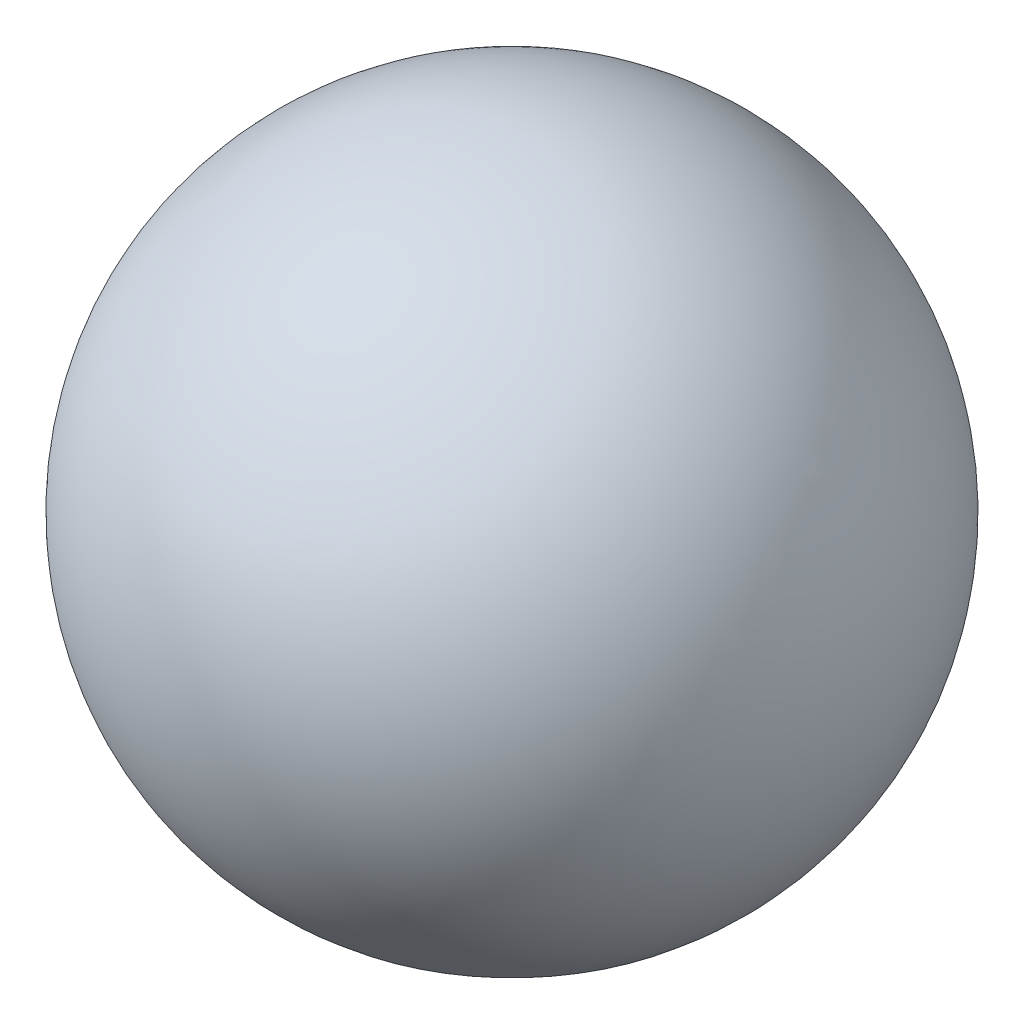
ISO-10303-21;
HEADER;
FILE_DESCRIPTION(('STEP AP214'),'2;1');
FILE_NAME('part.step','',(''),(''),'','','');
FILE_SCHEMA(('AUTOMOTIVE_DESIGN { 1 0 10303 214 1 1 1 1 }'));
ENDSEC;
DATA;
#1=APPLICATION_CONTEXT('core data for automotive mechanical design processes');
#2=APPLICATION_PROTOCOL_DEFINITION('international standard','automotive_design',2000,#1);
#3=PRODUCT_CONTEXT('',#1,'mechanical');
#4=PRODUCT('Part','Part','',(#3));
#5=PRODUCT_RELATED_PRODUCT_CATEGORY('part','',(#4));
#6=PRODUCT_DEFINITION_FORMATION('','',#4);
#7=PRODUCT_DEFINITION_CONTEXT('part definition',#1,'design');
#8=PRODUCT_DEFINITION('design','',#6,#7);
#9=PRODUCT_DEFINITION_SHAPE('','',#8);
#10=(LENGTH_UNIT() NAMED_UNIT(*) SI_UNIT(.MILLI.,.METRE.));
#11=(NAMED_UNIT(*) PLANE_ANGLE_UNIT() SI_UNIT($,.RADIAN.));
#12=(NAMED_UNIT(*) SI_UNIT($,.STERADIAN.) SOLID_ANGLE_UNIT());
#13=UNCERTAINTY_MEASURE_WITH_UNIT(LENGTH_MEASURE(1.E-05),#10,'distance_accuracy_value','');
#14=(GEOMETRIC_REPRESENTATION_CONTEXT(3) GLOBAL_UNCERTAINTY_ASSIGNED_CONTEXT((#13)) GLOBAL_UNIT_ASSIGNED_CONTEXT((#10,
#11,#12)) REPRESENTATION_CONTEXT('',''));
#15=CARTESIAN_POINT('',(0.,0.,0.));
#16=DIRECTION('',(0.,0.,1.));
#17=DIRECTION('',(1.,0.,0.));
#18=AXIS2_PLACEMENT_3D('',#15,#16,#17);
#19=CARTESIAN_POINT('',(0.,1359.,0.));
#20=DIRECTION('',(0.,-1.,0.));
#21=DIRECTION('',(1.,0.,0.));
#22=AXIS2_PLACEMENT_3D('',#19,#20,#21);
#23=SPHERICAL_SURFACE('',#22,1730.);
#24=CARTESIAN_POINT('',(0.,0.,0.));
#25=DIRECTION('',(0.,-1.,0.));
#26=DIRECTION('',(0.,0.,-1.));
#27=AXIS2_PLACEMENT_3D('',#24,#25,#26);
#28=CIRCLE('',#27,1070.52276949162);
#29=CARTESIAN_POINT('',(0.,0.,-1070.52276949162));
#30=VERTEX_POINT('',#29);
#31=EDGE_CURVE('E10',#30,#30,#28,.T.);
#32=ORIENTED_EDGE('',*,*,#31,.F.);
#33=EDGE_LOOP('',(#32));
#34=FACE_BOUND('',#33,.T.);
#35=ADVANCED_FACE('F31',(#34),#23,.T.);
#36=CARTESIAN_POINT('',(1054.28601432439,5.55111512312578E-13,0.));
#37=DIRECTION('',(0.,-1.,0.));
#38=DIRECTION('',(0.,0.,-1.));
#39=AXIS2_PLACEMENT_3D('',#36,#37,#38);
#40=PLANE('',#39);
#41=ORIENTED_EDGE('',*,*,#31,.T.);
#42=EDGE_LOOP('',(#41));
#43=FACE_BOUND('',#42,.T.);
#44=CARTESIAN_POINT('',(0.,1.11022302462516E-12,0.));
#45=DIRECTION('',(0.,-1.,0.));
#46=DIRECTION('',(0.,0.,-1.));
#47=AXIS2_PLACEMENT_3D('',#44,#45,#46);
#48=CIRCLE('',#47,1054.28601432439);
#49=CARTESIAN_POINT('',(0.,1.11022302462516E-12,-1054.28601432439));
#50=VERTEX_POINT('',#49);
#51=EDGE_CURVE('E37',#50,#50,#48,.T.);
#52=ORIENTED_EDGE('',*,*,#51,.F.);
#53=EDGE_LOOP('',(#52));
#54=FACE_BOUND('',#53,.T.);
#55=ADVANCED_FACE('F45',(#43,#54),#40,.T.);
#56=CARTESIAN_POINT('',(0.,1359.,0.));
#57=DIRECTION('',(0.,-1.,0.));
#58=DIRECTION('',(1.,0.,0.));
#59=AXIS2_PLACEMENT_3D('',#56,#57,#58);
#60=SPHERICAL_SURFACE('',#59,1720.);
#61=ORIENTED_EDGE('',*,*,#51,.T.);
#62=EDGE_LOOP('',(#61));
#63=FACE_BOUND('',#62,.T.);
#64=ADVANCED_FACE('F43',(#63),#60,.F.);
#65=CLOSED_SHELL('',(#35,#55,#64));
#66=MANIFOLD_SOLID_BREP('B2',#65);
#67=ADVANCED_BREP_SHAPE_REPRESENTATION('',(#18,#66),#14);
#68=SHAPE_DEFINITION_REPRESENTATION(#9,#67);
ENDSEC;
END-ISO-10303-21;
